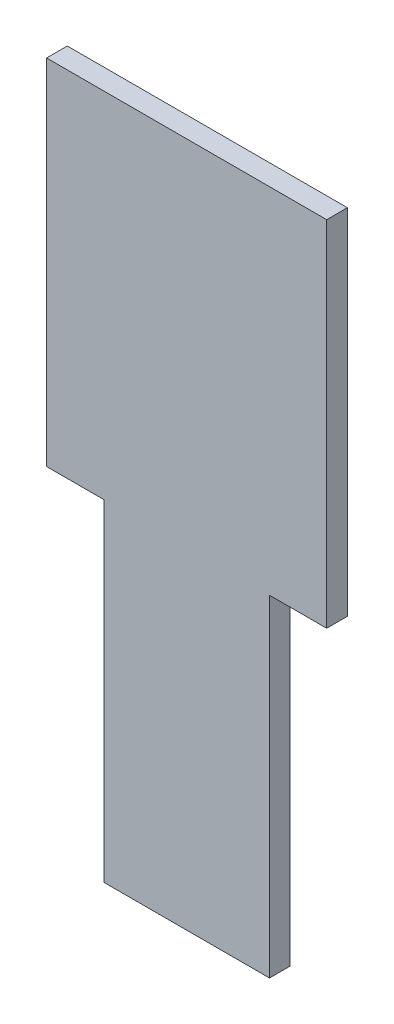
ISO-10303-21;
HEADER;
FILE_DESCRIPTION(('STEP AP214'),'2;1');
FILE_NAME('part.step','',(''),(''),'','','');
FILE_SCHEMA(('AUTOMOTIVE_DESIGN { 1 0 10303 214 1 1 1 1 }'));
ENDSEC;
DATA;
#1=APPLICATION_CONTEXT('core data for automotive mechanical design processes');
#2=APPLICATION_PROTOCOL_DEFINITION('international standard','automotive_design',2000,#1);
#3=PRODUCT_CONTEXT('',#1,'mechanical');
#4=PRODUCT('Part','Part','',(#3));
#5=PRODUCT_RELATED_PRODUCT_CATEGORY('part','',(#4));
#6=PRODUCT_DEFINITION_FORMATION('','',#4);
#7=PRODUCT_DEFINITION_CONTEXT('part definition',#1,'design');
#8=PRODUCT_DEFINITION('design','',#6,#7);
#9=PRODUCT_DEFINITION_SHAPE('','',#8);
#10=(LENGTH_UNIT() NAMED_UNIT(*) SI_UNIT(.MILLI.,.METRE.));
#11=(NAMED_UNIT(*) PLANE_ANGLE_UNIT() SI_UNIT($,.RADIAN.));
#12=(NAMED_UNIT(*) SI_UNIT($,.STERADIAN.) SOLID_ANGLE_UNIT());
#13=UNCERTAINTY_MEASURE_WITH_UNIT(LENGTH_MEASURE(1.E-05),#10,'distance_accuracy_value','');
#14=(GEOMETRIC_REPRESENTATION_CONTEXT(3) GLOBAL_UNCERTAINTY_ASSIGNED_CONTEXT((#13)) GLOBAL_UNIT_ASSIGNED_CONTEXT((#10,
#11,#12)) REPRESENTATION_CONTEXT('',''));
#15=CARTESIAN_POINT('',(0.,0.,0.));
#16=DIRECTION('',(0.,0.,1.));
#17=DIRECTION('',(1.,0.,0.));
#18=AXIS2_PLACEMENT_3D('',#15,#16,#17);
#19=CARTESIAN_POINT('',(42.926,105.029,6.35));
#20=DIRECTION('',(-1.,0.,0.));
#21=DIRECTION('',(0.,-1.,0.));
#22=AXIS2_PLACEMENT_3D('',#19,#20,#21);
#23=PLANE('',#22);
#24=DIRECTION('',(0.,1.,0.));
#25=VECTOR('',#24,1.);
#26=CARTESIAN_POINT('',(42.926,105.029,6.35));
#27=LINE('',#26,#25);
#28=CARTESIAN_POINT('',(42.926,-3.42899999999999,6.35));
#29=VERTEX_POINT('',#28);
#30=CARTESIAN_POINT('',(42.926,105.029,6.35));
#31=VERTEX_POINT('',#30);
#32=EDGE_CURVE('E137',#29,#31,#27,.T.);
#33=ORIENTED_EDGE('',*,*,#32,.F.);
#34=DIRECTION('',(0.,0.,1.));
#35=VECTOR('',#34,1.);
#36=CARTESIAN_POINT('',(42.926,-3.42899999999999,-0.00100000000000013));
#37=LINE('',#36,#35);
#38=CARTESIAN_POINT('',(42.926,-3.42899999999996,0.));
#39=VERTEX_POINT('',#38);
#40=EDGE_CURVE('E144',#39,#29,#37,.T.);
#41=ORIENTED_EDGE('',*,*,#40,.F.);
#42=DIRECTION('',(0.,1.,0.));
#43=VECTOR('',#42,1.);
#44=CARTESIAN_POINT('',(42.926,105.029,0.));
#45=LINE('',#44,#43);
#46=CARTESIAN_POINT('',(42.926,105.029,0.));
#47=VERTEX_POINT('',#46);
#48=EDGE_CURVE('E128',#39,#47,#45,.T.);
#49=ORIENTED_EDGE('',*,*,#48,.T.);
#50=DIRECTION('',(0.,0.,-1.));
#51=VECTOR('',#50,1.);
#52=CARTESIAN_POINT('',(42.926,105.029,6.35));
#53=LINE('',#52,#51);
#54=EDGE_CURVE('E11',#31,#47,#53,.T.);
#55=ORIENTED_EDGE('',*,*,#54,.F.);
#56=EDGE_LOOP('',(#33,#41,#49,#55));
#57=FACE_BOUND('',#56,.T.);
#58=ADVANCED_FACE('F33',(#57),#23,.F.);
#59=CARTESIAN_POINT('',(-42.926,105.029,6.35));
#60=DIRECTION('',(0.,-1.,0.));
#61=DIRECTION('',(0.,0.,-1.));
#62=AXIS2_PLACEMENT_3D('',#59,#60,#61);
#63=PLANE('',#62);
#64=DIRECTION('',(-1.,0.,0.));
#65=VECTOR('',#64,1.);
#66=CARTESIAN_POINT('',(-42.926,105.029,0.));
#67=LINE('',#66,#65);
#68=CARTESIAN_POINT('',(-42.926,105.029,0.));
#69=VERTEX_POINT('',#68);
#70=EDGE_CURVE('E130',#47,#69,#67,.T.);
#71=ORIENTED_EDGE('',*,*,#70,.T.);
#72=DIRECTION('',(0.,0.,-1.));
#73=VECTOR('',#72,1.);
#74=CARTESIAN_POINT('',(-42.926,105.029,6.35));
#75=LINE('',#74,#73);
#76=CARTESIAN_POINT('',(-42.926,105.029,6.35));
#77=VERTEX_POINT('',#76);
#78=EDGE_CURVE('E40',#77,#69,#75,.T.);
#79=ORIENTED_EDGE('',*,*,#78,.F.);
#80=DIRECTION('',(-1.,0.,0.));
#81=VECTOR('',#80,1.);
#82=CARTESIAN_POINT('',(-42.926,105.029,6.35));
#83=LINE('',#82,#81);
#84=EDGE_CURVE('E124',#31,#77,#83,.T.);
#85=ORIENTED_EDGE('',*,*,#84,.F.);
#86=ORIENTED_EDGE('',*,*,#54,.T.);
#87=EDGE_LOOP('',(#71,#79,#85,#86));
#88=FACE_BOUND('',#87,.T.);
#89=ADVANCED_FACE('F169',(#88),#63,.F.);
#90=CARTESIAN_POINT('',(-42.926,105.029,6.35));
#91=DIRECTION('',(1.,0.,0.));
#92=DIRECTION('',(0.,1.,0.));
#93=AXIS2_PLACEMENT_3D('',#90,#91,#92);
#94=PLANE('',#93);
#95=DIRECTION('',(0.,-1.,0.));
#96=VECTOR('',#95,1.);
#97=CARTESIAN_POINT('',(-42.926,105.029,0.));
#98=LINE('',#97,#96);
#99=CARTESIAN_POINT('',(-42.926,-3.429,0.));
#100=VERTEX_POINT('',#99);
#101=EDGE_CURVE('E133',#69,#100,#98,.T.);
#102=ORIENTED_EDGE('',*,*,#101,.T.);
#103=DIRECTION('',(0.,0.,1.));
#104=VECTOR('',#103,1.);
#105=CARTESIAN_POINT('',(-42.926,-3.429,-0.00100000000000013));
#106=LINE('',#105,#104);
#107=CARTESIAN_POINT('',(-42.926,-3.429,6.35));
#108=VERTEX_POINT('',#107);
#109=EDGE_CURVE('E154',#100,#108,#106,.T.);
#110=ORIENTED_EDGE('',*,*,#109,.T.);
#111=DIRECTION('',(0.,-1.,0.));
#112=VECTOR('',#111,1.);
#113=CARTESIAN_POINT('',(-42.926,105.029,6.35));
#114=LINE('',#113,#112);
#115=EDGE_CURVE('E121',#77,#108,#114,.T.);
#116=ORIENTED_EDGE('',*,*,#115,.F.);
#117=ORIENTED_EDGE('',*,*,#78,.T.);
#118=EDGE_LOOP('',(#102,#110,#116,#117));
#119=FACE_BOUND('',#118,.T.);
#120=ADVANCED_FACE('F164',(#119),#94,.F.);
#121=CARTESIAN_POINT('',(-42.926,-105.029,6.35));
#122=DIRECTION('',(0.,1.,0.));
#123=DIRECTION('',(0.,0.,1.));
#124=AXIS2_PLACEMENT_3D('',#121,#122,#123);
#125=PLANE('',#124);
#126=DIRECTION('',(1.,0.,0.));
#127=VECTOR('',#126,1.);
#128=CARTESIAN_POINT('',(-42.926,-105.029,6.35));
#129=LINE('',#128,#127);
#130=CARTESIAN_POINT('',(-25.273,-105.029,6.35));
#131=VERTEX_POINT('',#130);
#132=CARTESIAN_POINT('',(25.4,-105.029,6.35));
#133=VERTEX_POINT('',#132);
#134=EDGE_CURVE('E114',#131,#133,#129,.T.);
#135=ORIENTED_EDGE('',*,*,#134,.F.);
#136=DIRECTION('',(0.,0.,1.));
#137=VECTOR('',#136,1.);
#138=CARTESIAN_POINT('',(-25.273,-105.029,-0.00100000000000013));
#139=LINE('',#138,#137);
#140=CARTESIAN_POINT('',(-25.273,-105.029,0.));
#141=VERTEX_POINT('',#140);
#142=EDGE_CURVE('E98',#141,#131,#139,.T.);
#143=ORIENTED_EDGE('',*,*,#142,.F.);
#144=DIRECTION('',(1.,0.,0.));
#145=VECTOR('',#144,1.);
#146=CARTESIAN_POINT('',(-42.926,-105.029,0.));
#147=LINE('',#146,#145);
#148=CARTESIAN_POINT('',(25.4,-105.029,0.));
#149=VERTEX_POINT('',#148);
#150=EDGE_CURVE('E136',#141,#149,#147,.T.);
#151=ORIENTED_EDGE('',*,*,#150,.T.);
#152=DIRECTION('',(0.,0.,1.));
#153=VECTOR('',#152,1.);
#154=CARTESIAN_POINT('',(25.4,-105.029,-0.00100000000000013));
#155=LINE('',#154,#153);
#156=EDGE_CURVE('E120',#149,#133,#155,.T.);
#157=ORIENTED_EDGE('',*,*,#156,.T.);
#158=EDGE_LOOP('',(#135,#143,#151,#157));
#159=FACE_BOUND('',#158,.T.);
#160=ADVANCED_FACE('F119',(#159),#125,.F.);
#161=CARTESIAN_POINT('',(0.,0.,6.35));
#162=DIRECTION('',(0.,0.,1.));
#163=DIRECTION('',(1.,0.,0.));
#164=AXIS2_PLACEMENT_3D('',#161,#162,#163);
#165=PLANE('',#164);
#166=DIRECTION('',(-1.,0.,0.));
#167=VECTOR('',#166,1.);
#168=CARTESIAN_POINT('',(-42.926,-3.429,6.35));
#169=LINE('',#168,#167);
#170=CARTESIAN_POINT('',(-25.273,-3.429,6.35));
#171=VERTEX_POINT('',#170);
#172=EDGE_CURVE('E109',#171,#108,#169,.T.);
#173=ORIENTED_EDGE('',*,*,#172,.F.);
#174=DIRECTION('',(0.,1.,0.));
#175=VECTOR('',#174,1.);
#176=CARTESIAN_POINT('',(-25.273,-3.429,6.35));
#177=LINE('',#176,#175);
#178=EDGE_CURVE('E101',#131,#171,#177,.T.);
#179=ORIENTED_EDGE('',*,*,#178,.F.);
#180=ORIENTED_EDGE('',*,*,#134,.T.);
#181=DIRECTION('',(0.,-1.,0.));
#182=VECTOR('',#181,1.);
#183=CARTESIAN_POINT('',(25.4,-105.029,6.35));
#184=LINE('',#183,#182);
#185=CARTESIAN_POINT('',(25.4,-3.42899999999999,6.35));
#186=VERTEX_POINT('',#185);
#187=EDGE_CURVE('E147',#186,#133,#184,.T.);
#188=ORIENTED_EDGE('',*,*,#187,.F.);
#189=DIRECTION('',(-1.,0.,0.));
#190=VECTOR('',#189,1.);
#191=CARTESIAN_POINT('',(42.926,-3.42899999999999,6.35));
#192=LINE('',#191,#190);
#193=EDGE_CURVE('E151',#29,#186,#192,.T.);
#194=ORIENTED_EDGE('',*,*,#193,.F.);
#195=ORIENTED_EDGE('',*,*,#32,.T.);
#196=ORIENTED_EDGE('',*,*,#84,.T.);
#197=ORIENTED_EDGE('',*,*,#115,.T.);
#198=EDGE_LOOP('',(#173,#179,#180,#188,#194,#195,#196,#197));
#199=FACE_BOUND('',#198,.T.);
#200=ADVANCED_FACE('F112',(#199),#165,.T.);
#201=CARTESIAN_POINT('',(0.,0.,0.));
#202=DIRECTION('',(0.,0.,1.));
#203=DIRECTION('',(1.,0.,0.));
#204=AXIS2_PLACEMENT_3D('',#201,#202,#203);
#205=PLANE('',#204);
#206=DIRECTION('',(0.,-1.,0.));
#207=VECTOR('',#206,1.);
#208=CARTESIAN_POINT('',(-25.273,-3.429,0.));
#209=LINE('',#208,#207);
#210=CARTESIAN_POINT('',(-25.273,-3.429,0.));
#211=VERTEX_POINT('',#210);
#212=EDGE_CURVE('E104',#211,#141,#209,.T.);
#213=ORIENTED_EDGE('',*,*,#212,.F.);
#214=DIRECTION('',(1.,0.,0.));
#215=VECTOR('',#214,1.);
#216=CARTESIAN_POINT('',(-42.926,-3.429,0.));
#217=LINE('',#216,#215);
#218=EDGE_CURVE('E47',#100,#211,#217,.T.);
#219=ORIENTED_EDGE('',*,*,#218,.F.);
#220=ORIENTED_EDGE('',*,*,#101,.F.);
#221=ORIENTED_EDGE('',*,*,#70,.F.);
#222=ORIENTED_EDGE('',*,*,#48,.F.);
#223=DIRECTION('',(1.,0.,0.));
#224=VECTOR('',#223,1.);
#225=CARTESIAN_POINT('',(42.926,-3.42899999999999,0.));
#226=LINE('',#225,#224);
#227=CARTESIAN_POINT('',(25.4,-3.42899999999999,0.));
#228=VERTEX_POINT('',#227);
#229=EDGE_CURVE('E131',#228,#39,#226,.T.);
#230=ORIENTED_EDGE('',*,*,#229,.F.);
#231=DIRECTION('',(0.,1.,0.));
#232=VECTOR('',#231,1.);
#233=CARTESIAN_POINT('',(25.4,-105.029,0.));
#234=LINE('',#233,#232);
#235=EDGE_CURVE('E55',#149,#228,#234,.T.);
#236=ORIENTED_EDGE('',*,*,#235,.F.);
#237=ORIENTED_EDGE('',*,*,#150,.F.);
#238=EDGE_LOOP('',(#213,#219,#220,#221,#222,#230,#236,#237));
#239=FACE_BOUND('',#238,.T.);
#240=ADVANCED_FACE('F172',(#239),#205,.F.);
#241=CARTESIAN_POINT('',(25.4,-105.029,-0.00100000000000013));
#242=DIRECTION('',(-1.,0.,0.));
#243=DIRECTION('',(0.,0.,1.));
#244=AXIS2_PLACEMENT_3D('',#241,#242,#243);
#245=PLANE('',#244);
#246=ORIENTED_EDGE('',*,*,#235,.T.);
#247=DIRECTION('',(0.,0.,1.));
#248=VECTOR('',#247,1.);
#249=CARTESIAN_POINT('',(25.4,-3.42899999999999,-0.00100000000000013));
#250=LINE('',#249,#248);
#251=EDGE_CURVE('E146',#228,#186,#250,.T.);
#252=ORIENTED_EDGE('',*,*,#251,.T.);
#253=ORIENTED_EDGE('',*,*,#187,.T.);
#254=ORIENTED_EDGE('',*,*,#156,.F.);
#255=EDGE_LOOP('',(#246,#252,#253,#254));
#256=FACE_BOUND('',#255,.T.);
#257=ADVANCED_FACE('F192',(#256),#245,.F.);
#258=CARTESIAN_POINT('',(42.926,-3.42899999999999,-0.00100000000000013));
#259=DIRECTION('',(0.,1.,0.));
#260=DIRECTION('',(0.,0.,1.));
#261=AXIS2_PLACEMENT_3D('',#258,#259,#260);
#262=PLANE('',#261);
#263=ORIENTED_EDGE('',*,*,#229,.T.);
#264=ORIENTED_EDGE('',*,*,#40,.T.);
#265=ORIENTED_EDGE('',*,*,#193,.T.);
#266=ORIENTED_EDGE('',*,*,#251,.F.);
#267=EDGE_LOOP('',(#263,#264,#265,#266));
#268=FACE_BOUND('',#267,.T.);
#269=ADVANCED_FACE('F177',(#268),#262,.F.);
#270=CARTESIAN_POINT('',(-42.926,-3.429,-0.00100000000000013));
#271=DIRECTION('',(0.,1.,0.));
#272=DIRECTION('',(0.,0.,1.));
#273=AXIS2_PLACEMENT_3D('',#270,#271,#272);
#274=PLANE('',#273);
#275=ORIENTED_EDGE('',*,*,#218,.T.);
#276=DIRECTION('',(0.,0.,1.));
#277=VECTOR('',#276,1.);
#278=CARTESIAN_POINT('',(-25.273,-3.429,-0.00100000000000013));
#279=LINE('',#278,#277);
#280=EDGE_CURVE('E108',#211,#171,#279,.T.);
#281=ORIENTED_EDGE('',*,*,#280,.T.);
#282=ORIENTED_EDGE('',*,*,#172,.T.);
#283=ORIENTED_EDGE('',*,*,#109,.F.);
#284=EDGE_LOOP('',(#275,#281,#282,#283));
#285=FACE_BOUND('',#284,.T.);
#286=ADVANCED_FACE('F161',(#285),#274,.F.);
#287=CARTESIAN_POINT('',(-25.273,-3.429,-0.00100000000000013));
#288=DIRECTION('',(1.,0.,0.));
#289=DIRECTION('',(0.,1.,0.));
#290=AXIS2_PLACEMENT_3D('',#287,#288,#289);
#291=PLANE('',#290);
#292=ORIENTED_EDGE('',*,*,#212,.T.);
#293=ORIENTED_EDGE('',*,*,#142,.T.);
#294=ORIENTED_EDGE('',*,*,#178,.T.);
#295=ORIENTED_EDGE('',*,*,#280,.F.);
#296=EDGE_LOOP('',(#292,#293,#294,#295));
#297=FACE_BOUND('',#296,.T.);
#298=ADVANCED_FACE('F100',(#297),#291,.F.);
#299=CLOSED_SHELL('',(#58,#89,#120,#160,#200,#240,#257,#269,#286,#298));
#300=MANIFOLD_SOLID_BREP('B2',#299);
#301=ADVANCED_BREP_SHAPE_REPRESENTATION('',(#18,#300),#14);
#302=SHAPE_DEFINITION_REPRESENTATION(#9,#301);
ENDSEC;
END-ISO-10303-21;
